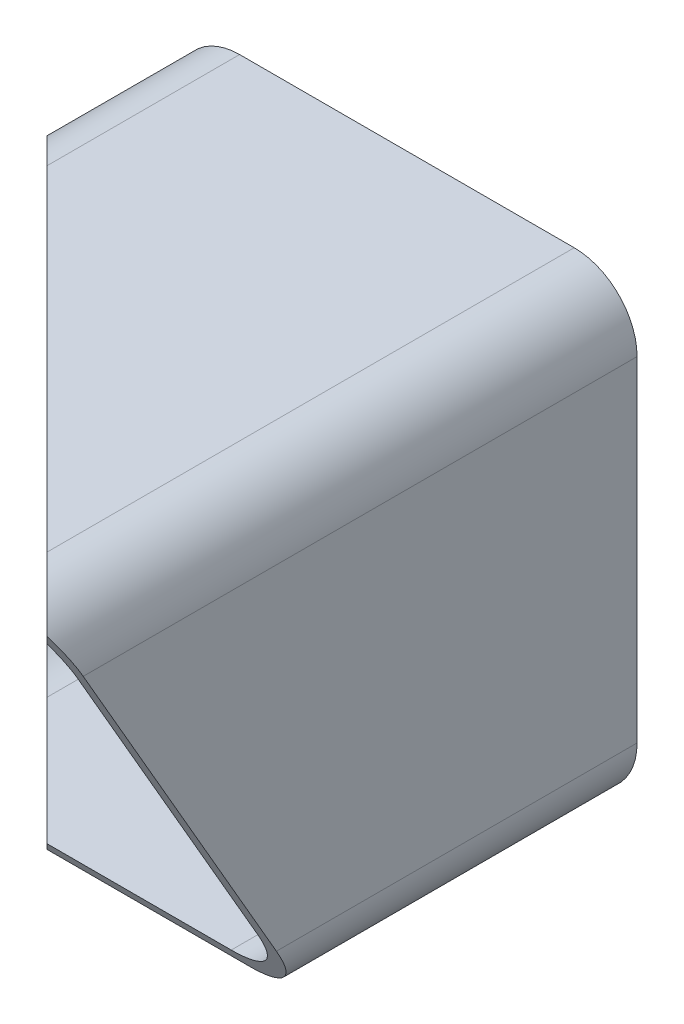
ISO-10303-21;
HEADER;
FILE_DESCRIPTION(('STEP AP214'),'2;1');
FILE_NAME('part.step','',(''),(''),'','','');
FILE_SCHEMA(('AUTOMOTIVE_DESIGN { 1 0 10303 214 1 1 1 1 }'));
ENDSEC;
DATA;
#1=APPLICATION_CONTEXT('core data for automotive mechanical design processes');
#2=APPLICATION_PROTOCOL_DEFINITION('international standard','automotive_design',2000,#1);
#3=PRODUCT_CONTEXT('',#1,'mechanical');
#4=PRODUCT('Part','Part','',(#3));
#5=PRODUCT_RELATED_PRODUCT_CATEGORY('part','',(#4));
#6=PRODUCT_DEFINITION_FORMATION('','',#4);
#7=PRODUCT_DEFINITION_CONTEXT('part definition',#1,'design');
#8=PRODUCT_DEFINITION('design','',#6,#7);
#9=PRODUCT_DEFINITION_SHAPE('','',#8);
#10=(LENGTH_UNIT() NAMED_UNIT(*) SI_UNIT(.MILLI.,.METRE.));
#11=(NAMED_UNIT(*) PLANE_ANGLE_UNIT() SI_UNIT($,.RADIAN.));
#12=(NAMED_UNIT(*) SI_UNIT($,.STERADIAN.) SOLID_ANGLE_UNIT());
#13=UNCERTAINTY_MEASURE_WITH_UNIT(LENGTH_MEASURE(1.E-05),#10,'distance_accuracy_value','');
#14=(GEOMETRIC_REPRESENTATION_CONTEXT(3) GLOBAL_UNCERTAINTY_ASSIGNED_CONTEXT((#13)) GLOBAL_UNIT_ASSIGNED_CONTEXT((#10,
#11,#12)) REPRESENTATION_CONTEXT('',''));
#15=CARTESIAN_POINT('',(0.,0.,0.));
#16=DIRECTION('',(0.,0.,1.));
#17=DIRECTION('',(1.,0.,0.));
#18=AXIS2_PLACEMENT_3D('',#15,#16,#17);
#19=CARTESIAN_POINT('',(0.,0.,-50.));
#20=DIRECTION('',(0.,0.,-1.));
#21=DIRECTION('',(-1.,0.,0.));
#22=AXIS2_PLACEMENT_3D('',#19,#20,#21);
#23=PLANE('',#22);
#24=DIRECTION('',(1.,0.,0.));
#25=VECTOR('',#24,1.);
#26=CARTESIAN_POINT('',(-39.,-39.,-50.));
#27=LINE('',#26,#25);
#28=CARTESIAN_POINT('',(-28.35,-39.,-50.));
#29=VERTEX_POINT('',#28);
#30=CARTESIAN_POINT('',(28.35,-39.,-50.));
#31=VERTEX_POINT('',#30);
#32=EDGE_CURVE('E255',#29,#31,#27,.T.);
#33=ORIENTED_EDGE('',*,*,#32,.F.);
#34=CARTESIAN_POINT('',(-28.35,-28.35,-50.));
#35=DIRECTION('',(0.,0.,-1.));
#36=DIRECTION('',(-1.,0.,0.));
#37=AXIS2_PLACEMENT_3D('',#34,#35,#36);
#38=CIRCLE('',#37,10.65);
#39=CARTESIAN_POINT('',(-39.,-28.35,-50.));
#40=VERTEX_POINT('',#39);
#41=EDGE_CURVE('E197',#29,#40,#38,.T.);
#42=ORIENTED_EDGE('',*,*,#41,.T.);
#43=DIRECTION('',(0.,-1.,0.));
#44=VECTOR('',#43,1.);
#45=CARTESIAN_POINT('',(-39.,-39.,-50.));
#46=LINE('',#45,#44);
#47=CARTESIAN_POINT('',(-39.,28.35,-50.));
#48=VERTEX_POINT('',#47);
#49=EDGE_CURVE('E253',#48,#40,#46,.T.);
#50=ORIENTED_EDGE('',*,*,#49,.F.);
#51=CARTESIAN_POINT('',(-28.35,28.35,-50.));
#52=DIRECTION('',(0.,0.,-1.));
#53=DIRECTION('',(-1.,0.,0.));
#54=AXIS2_PLACEMENT_3D('',#51,#52,#53);
#55=CIRCLE('',#54,10.65);
#56=CARTESIAN_POINT('',(-28.35,39.,-50.));
#57=VERTEX_POINT('',#56);
#58=EDGE_CURVE('E56',#48,#57,#55,.T.);
#59=ORIENTED_EDGE('',*,*,#58,.T.);
#60=DIRECTION('',(-1.,0.,0.));
#61=VECTOR('',#60,1.);
#62=CARTESIAN_POINT('',(-39.,39.,-50.));
#63=LINE('',#62,#61);
#64=CARTESIAN_POINT('',(28.35,39.,-50.));
#65=VERTEX_POINT('',#64);
#66=EDGE_CURVE('E251',#65,#57,#63,.T.);
#67=ORIENTED_EDGE('',*,*,#66,.F.);
#68=CARTESIAN_POINT('',(28.35,28.35,-50.));
#69=DIRECTION('',(0.,0.,-1.));
#70=DIRECTION('',(-1.,0.,0.));
#71=AXIS2_PLACEMENT_3D('',#68,#69,#70);
#72=CIRCLE('',#71,10.65);
#73=CARTESIAN_POINT('',(39.,28.35,-50.));
#74=VERTEX_POINT('',#73);
#75=EDGE_CURVE('E180',#65,#74,#72,.T.);
#76=ORIENTED_EDGE('',*,*,#75,.T.);
#77=DIRECTION('',(0.,1.,0.));
#78=VECTOR('',#77,1.);
#79=CARTESIAN_POINT('',(39.,-39.,-50.));
#80=LINE('',#79,#78);
#81=CARTESIAN_POINT('',(39.,-28.35,-50.));
#82=VERTEX_POINT('',#81);
#83=EDGE_CURVE('E248',#82,#74,#80,.T.);
#84=ORIENTED_EDGE('',*,*,#83,.F.);
#85=CARTESIAN_POINT('',(28.35,-28.35,-50.));
#86=DIRECTION('',(0.,0.,-1.));
#87=DIRECTION('',(-1.,0.,0.));
#88=AXIS2_PLACEMENT_3D('',#85,#86,#87);
#89=CIRCLE('',#88,10.65);
#90=EDGE_CURVE('E196',#82,#31,#89,.T.);
#91=ORIENTED_EDGE('',*,*,#90,.T.);
#92=EDGE_LOOP('',(#33,#42,#50,#59,#67,#76,#84,#91));
#93=FACE_BOUND('',#92,.T.);
#94=DIRECTION('',(0.,-1.,0.));
#95=VECTOR('',#94,1.);
#96=CARTESIAN_POINT('',(-37.,-37.,-50.));
#97=LINE('',#96,#95);
#98=CARTESIAN_POINT('',(-37.,26.35,-50.));
#99=VERTEX_POINT('',#98);
#100=CARTESIAN_POINT('',(-37.,-26.35,-50.));
#101=VERTEX_POINT('',#100);
#102=EDGE_CURVE('E242',#99,#101,#97,.T.);
#103=ORIENTED_EDGE('',*,*,#102,.T.);
#104=CARTESIAN_POINT('',(-26.35,-26.35,-50.));
#105=DIRECTION('',(0.,0.,-1.));
#106=DIRECTION('',(-1.,0.,0.));
#107=AXIS2_PLACEMENT_3D('',#104,#105,#106);
#108=CIRCLE('',#107,10.65);
#109=CARTESIAN_POINT('',(-26.35,-37.,-50.));
#110=VERTEX_POINT('',#109);
#111=EDGE_CURVE('E190',#101,#110,#108,.F.);
#112=ORIENTED_EDGE('',*,*,#111,.T.);
#113=DIRECTION('',(1.,0.,0.));
#114=VECTOR('',#113,1.);
#115=CARTESIAN_POINT('',(-37.,-37.,-50.));
#116=LINE('',#115,#114);
#117=CARTESIAN_POINT('',(26.35,-37.,-50.));
#118=VERTEX_POINT('',#117);
#119=EDGE_CURVE('E245',#110,#118,#116,.T.);
#120=ORIENTED_EDGE('',*,*,#119,.T.);
#121=CARTESIAN_POINT('',(26.35,-26.35,-50.));
#122=DIRECTION('',(0.,0.,-1.));
#123=DIRECTION('',(-1.,0.,0.));
#124=AXIS2_PLACEMENT_3D('',#121,#122,#123);
#125=CIRCLE('',#124,10.65);
#126=CARTESIAN_POINT('',(37.,-26.35,-50.));
#127=VERTEX_POINT('',#126);
#128=EDGE_CURVE('E181',#118,#127,#125,.F.);
#129=ORIENTED_EDGE('',*,*,#128,.T.);
#130=DIRECTION('',(0.,1.,0.));
#131=VECTOR('',#130,1.);
#132=CARTESIAN_POINT('',(37.,-37.,-50.));
#133=LINE('',#132,#131);
#134=CARTESIAN_POINT('',(37.,26.35,-50.));
#135=VERTEX_POINT('',#134);
#136=EDGE_CURVE('E236',#127,#135,#133,.T.);
#137=ORIENTED_EDGE('',*,*,#136,.T.);
#138=CARTESIAN_POINT('',(26.35,26.35,-50.));
#139=DIRECTION('',(0.,0.,-1.));
#140=DIRECTION('',(-1.,0.,0.));
#141=AXIS2_PLACEMENT_3D('',#138,#139,#140);
#142=CIRCLE('',#141,10.65);
#143=CARTESIAN_POINT('',(26.35,37.,-50.));
#144=VERTEX_POINT('',#143);
#145=EDGE_CURVE('E183',#135,#144,#142,.F.);
#146=ORIENTED_EDGE('',*,*,#145,.T.);
#147=DIRECTION('',(-1.,0.,0.));
#148=VECTOR('',#147,1.);
#149=CARTESIAN_POINT('',(-37.,37.,-50.));
#150=LINE('',#149,#148);
#151=CARTESIAN_POINT('',(-26.35,37.,-50.));
#152=VERTEX_POINT('',#151);
#153=EDGE_CURVE('E239',#144,#152,#150,.T.);
#154=ORIENTED_EDGE('',*,*,#153,.T.);
#155=CARTESIAN_POINT('',(-26.35,26.35,-50.));
#156=DIRECTION('',(0.,0.,-1.));
#157=DIRECTION('',(-1.,0.,0.));
#158=AXIS2_PLACEMENT_3D('',#155,#156,#157);
#159=CIRCLE('',#158,10.65);
#160=EDGE_CURVE('E192',#152,#99,#159,.F.);
#161=ORIENTED_EDGE('',*,*,#160,.T.);
#162=EDGE_LOOP('',(#103,#112,#120,#129,#137,#146,#154,#161));
#163=FACE_BOUND('',#162,.T.);
#164=ADVANCED_FACE('F33',(#93,#163),#23,.T.);
#165=CARTESIAN_POINT('',(39.,-39.,50.));
#166=DIRECTION('',(-1.,0.,0.));
#167=DIRECTION('',(0.,0.,1.));
#168=AXIS2_PLACEMENT_3D('',#165,#166,#167);
#169=PLANE('',#168);
#170=DIRECTION('',(0.,0.,-1.));
#171=VECTOR('',#170,1.);
#172=CARTESIAN_POINT('',(39.,28.35,50.));
#173=LINE('',#172,#171);
#174=CARTESIAN_POINT('',(39.,28.35,43.8512196331306));
#175=VERTEX_POINT('',#174);
#176=EDGE_CURVE('E285',#74,#175,#173,.F.);
#177=ORIENTED_EDGE('',*,*,#176,.T.);
#178=DIRECTION('',(0.,0.866025403784442,0.499999999999995));
#179=VECTOR('',#178,1.);
#180=CARTESIAN_POINT('',(39.,-39.,4.9666790032098));
#181=LINE('',#180,#179);
#182=CARTESIAN_POINT('',(39.,-28.35,11.1154593700792));
#183=VERTEX_POINT('',#182);
#184=EDGE_CURVE('E218',#183,#175,#181,.T.);
#185=ORIENTED_EDGE('',*,*,#184,.F.);
#186=DIRECTION('',(0.,0.,-1.));
#187=VECTOR('',#186,1.);
#188=CARTESIAN_POINT('',(39.,-28.35,50.));
#189=LINE('',#188,#187);
#190=EDGE_CURVE('E185',#183,#82,#189,.T.);
#191=ORIENTED_EDGE('',*,*,#190,.T.);
#192=ORIENTED_EDGE('',*,*,#83,.T.);
#193=EDGE_LOOP('',(#177,#185,#191,#192));
#194=FACE_BOUND('',#193,.T.);
#195=ADVANCED_FACE('F291',(#194),#169,.F.);
#196=CARTESIAN_POINT('',(-39.,39.,50.));
#197=DIRECTION('',(0.,-1.,0.));
#198=DIRECTION('',(0.,0.,-1.));
#199=AXIS2_PLACEMENT_3D('',#196,#197,#198);
#200=PLANE('',#199);
#201=DIRECTION('',(0.,0.,-1.));
#202=VECTOR('',#201,1.);
#203=CARTESIAN_POINT('',(-28.35,39.,50.));
#204=LINE('',#203,#202);
#205=CARTESIAN_POINT('',(-28.35,39.,-17.3499999999993));
#206=VERTEX_POINT('',#205);
#207=EDGE_CURVE('E176',#57,#206,#204,.F.);
#208=ORIENTED_EDGE('',*,*,#207,.T.);
#209=DIRECTION('',(-0.707106781186551,0.,-0.707106781186544));
#210=VECTOR('',#209,1.);
#211=CARTESIAN_POINT('',(39.,39.,50.));
#212=LINE('',#211,#210);
#213=CARTESIAN_POINT('',(28.35,39.,39.3500000000001));
#214=VERTEX_POINT('',#213);
#215=EDGE_CURVE('E161',#214,#206,#212,.T.);
#216=ORIENTED_EDGE('',*,*,#215,.F.);
#217=DIRECTION('',(0.,0.,-1.));
#218=VECTOR('',#217,1.);
#219=CARTESIAN_POINT('',(28.35,39.,50.));
#220=LINE('',#219,#218);
#221=EDGE_CURVE('E173',#214,#65,#220,.T.);
#222=ORIENTED_EDGE('',*,*,#221,.T.);
#223=ORIENTED_EDGE('',*,*,#66,.T.);
#224=EDGE_LOOP('',(#208,#216,#222,#223));
#225=FACE_BOUND('',#224,.T.);
#226=ADVANCED_FACE('F172',(#225),#200,.F.);
#227=CARTESIAN_POINT('',(-39.,-39.,50.));
#228=DIRECTION('',(1.,0.,0.));
#229=DIRECTION('',(0.,0.,-1.));
#230=AXIS2_PLACEMENT_3D('',#227,#228,#229);
#231=PLANE('',#230);
#232=DIRECTION('',(0.,0.,-1.));
#233=VECTOR('',#232,1.);
#234=CARTESIAN_POINT('',(-39.,-28.35,50.));
#235=LINE('',#234,#233);
#236=CARTESIAN_POINT('',(-39.,-28.35,-27.9999999999991));
#237=VERTEX_POINT('',#236);
#238=EDGE_CURVE('E277',#40,#237,#235,.F.);
#239=ORIENTED_EDGE('',*,*,#238,.T.);
#240=DIRECTION('',(0.,1.,0.));
#241=VECTOR('',#240,1.);
#242=CARTESIAN_POINT('',(-39.,-39.,-27.9999999999991));
#243=LINE('',#242,#241);
#244=CARTESIAN_POINT('',(-39.,28.35,-27.9999999999991));
#245=VERTEX_POINT('',#244);
#246=EDGE_CURVE('E315',#237,#245,#243,.T.);
#247=ORIENTED_EDGE('',*,*,#246,.T.);
#248=DIRECTION('',(0.,0.,-1.));
#249=VECTOR('',#248,1.);
#250=CARTESIAN_POINT('',(-39.,28.35,50.));
#251=LINE('',#250,#249);
#252=EDGE_CURVE('E275',#245,#48,#251,.T.);
#253=ORIENTED_EDGE('',*,*,#252,.T.);
#254=ORIENTED_EDGE('',*,*,#49,.T.);
#255=EDGE_LOOP('',(#239,#247,#253,#254));
#256=FACE_BOUND('',#255,.T.);
#257=ADVANCED_FACE('F318',(#256),#231,.F.);
#258=CARTESIAN_POINT('',(-39.,-39.,50.));
#259=DIRECTION('',(0.,1.,0.));
#260=DIRECTION('',(0.,0.,1.));
#261=AXIS2_PLACEMENT_3D('',#258,#259,#260);
#262=PLANE('',#261);
#263=DIRECTION('',(1.,0.,0.));
#264=VECTOR('',#263,1.);
#265=CARTESIAN_POINT('',(-39.,-39.,4.9666790032098));
#266=LINE('',#265,#264);
#267=CARTESIAN_POINT('',(-6.03332099679071,-39.,4.9666790032098));
#268=VERTEX_POINT('',#267);
#269=CARTESIAN_POINT('',(28.35,-39.,4.9666790032098));
#270=VERTEX_POINT('',#269);
#271=EDGE_CURVE('E205',#268,#270,#266,.T.);
#272=ORIENTED_EDGE('',*,*,#271,.F.);
#273=DIRECTION('',(-0.707106781186551,0.,-0.707106781186544));
#274=VECTOR('',#273,1.);
#275=CARTESIAN_POINT('',(39.,-39.,50.));
#276=LINE('',#275,#274);
#277=CARTESIAN_POINT('',(-28.35,-39.,-17.3499999999993));
#278=VERTEX_POINT('',#277);
#279=EDGE_CURVE('E48',#268,#278,#276,.T.);
#280=ORIENTED_EDGE('',*,*,#279,.T.);
#281=DIRECTION('',(0.,0.,-1.));
#282=VECTOR('',#281,1.);
#283=CARTESIAN_POINT('',(-28.35,-39.,50.));
#284=LINE('',#283,#282);
#285=EDGE_CURVE('E273',#278,#29,#284,.T.);
#286=ORIENTED_EDGE('',*,*,#285,.T.);
#287=ORIENTED_EDGE('',*,*,#32,.T.);
#288=DIRECTION('',(0.,0.,-1.));
#289=VECTOR('',#288,1.);
#290=CARTESIAN_POINT('',(28.35,-39.,50.));
#291=LINE('',#290,#289);
#292=EDGE_CURVE('E216',#31,#270,#291,.F.);
#293=ORIENTED_EDGE('',*,*,#292,.T.);
#294=EDGE_LOOP('',(#272,#280,#286,#287,#293));
#295=FACE_BOUND('',#294,.T.);
#296=ADVANCED_FACE('F212',(#295),#262,.F.);
#297=CARTESIAN_POINT('',(37.,-37.,50.));
#298=DIRECTION('',(-1.,0.,0.));
#299=DIRECTION('',(0.,0.,1.));
#300=AXIS2_PLACEMENT_3D('',#297,#298,#299);
#301=PLANE('',#300);
#302=DIRECTION('',(0.,-0.866025403784442,-0.499999999999995));
#303=VECTOR('',#302,1.);
#304=CARTESIAN_POINT('',(37.,-18.0000000000004,17.0910346561915));
#305=LINE('',#304,#303);
#306=CARTESIAN_POINT('',(37.,26.35,42.6965190947513));
#307=VERTEX_POINT('',#306);
#308=CARTESIAN_POINT('',(37.,-26.35,12.2701599084585));
#309=VERTEX_POINT('',#308);
#310=EDGE_CURVE('E227',#307,#309,#305,.T.);
#311=ORIENTED_EDGE('',*,*,#310,.F.);
#312=DIRECTION('',(0.,0.,-1.));
#313=VECTOR('',#312,1.);
#314=CARTESIAN_POINT('',(37.,26.35,-50.));
#315=LINE('',#314,#313);
#316=EDGE_CURVE('E262',#307,#135,#315,.T.);
#317=ORIENTED_EDGE('',*,*,#316,.T.);
#318=ORIENTED_EDGE('',*,*,#136,.F.);
#319=DIRECTION('',(0.,0.,-1.));
#320=VECTOR('',#319,1.);
#321=CARTESIAN_POINT('',(37.,-26.35,50.));
#322=LINE('',#321,#320);
#323=EDGE_CURVE('E264',#127,#309,#322,.F.);
#324=ORIENTED_EDGE('',*,*,#323,.T.);
#325=EDGE_LOOP('',(#311,#317,#318,#324));
#326=FACE_BOUND('',#325,.T.);
#327=ADVANCED_FACE('F345',(#326),#301,.T.);
#328=CARTESIAN_POINT('',(-37.,37.,50.));
#329=DIRECTION('',(0.,-1.,0.));
#330=DIRECTION('',(0.,0.,-1.));
#331=AXIS2_PLACEMENT_3D('',#328,#329,#330);
#332=PLANE('',#331);
#333=DIRECTION('',(0.707106781186551,0.,0.707106781186544));
#334=VECTOR('',#333,1.);
#335=CARTESIAN_POINT('',(0.999999999999578,37.,12.));
#336=LINE('',#335,#334);
#337=CARTESIAN_POINT('',(-26.35,37.,-15.3499999999993));
#338=VERTEX_POINT('',#337);
#339=CARTESIAN_POINT('',(26.35,37.,37.3500000000002));
#340=VERTEX_POINT('',#339);
#341=EDGE_CURVE('E303',#338,#340,#336,.T.);
#342=ORIENTED_EDGE('',*,*,#341,.F.);
#343=DIRECTION('',(0.,0.,-1.));
#344=VECTOR('',#343,1.);
#345=CARTESIAN_POINT('',(-26.35,37.,-50.));
#346=LINE('',#345,#344);
#347=EDGE_CURVE('E267',#338,#152,#346,.T.);
#348=ORIENTED_EDGE('',*,*,#347,.T.);
#349=ORIENTED_EDGE('',*,*,#153,.F.);
#350=DIRECTION('',(0.,0.,-1.));
#351=VECTOR('',#350,1.);
#352=CARTESIAN_POINT('',(26.35,37.,50.));
#353=LINE('',#352,#351);
#354=EDGE_CURVE('E269',#144,#340,#353,.F.);
#355=ORIENTED_EDGE('',*,*,#354,.T.);
#356=EDGE_LOOP('',(#342,#348,#349,#355));
#357=FACE_BOUND('',#356,.T.);
#358=ADVANCED_FACE('F382',(#357),#332,.T.);
#359=CARTESIAN_POINT('',(-37.,-37.,50.));
#360=DIRECTION('',(1.,0.,0.));
#361=DIRECTION('',(0.,0.,-1.));
#362=AXIS2_PLACEMENT_3D('',#359,#360,#361);
#363=PLANE('',#362);
#364=DIRECTION('',(0.,1.,0.));
#365=VECTOR('',#364,1.);
#366=CARTESIAN_POINT('',(-37.,-37.,-25.9999999999992));
#367=LINE('',#366,#365);
#368=CARTESIAN_POINT('',(-37.,-26.35,-25.9999999999991));
#369=VERTEX_POINT('',#368);
#370=CARTESIAN_POINT('',(-37.,26.35,-25.9999999999992));
#371=VERTEX_POINT('',#370);
#372=EDGE_CURVE('E308',#369,#371,#367,.T.);
#373=ORIENTED_EDGE('',*,*,#372,.F.);
#374=DIRECTION('',(0.,0.,-1.));
#375=VECTOR('',#374,1.);
#376=CARTESIAN_POINT('',(-37.,-26.35,-50.));
#377=LINE('',#376,#375);
#378=EDGE_CURVE('E283',#369,#101,#377,.T.);
#379=ORIENTED_EDGE('',*,*,#378,.T.);
#380=ORIENTED_EDGE('',*,*,#102,.F.);
#381=DIRECTION('',(0.,0.,-1.));
#382=VECTOR('',#381,1.);
#383=CARTESIAN_POINT('',(-37.,26.35,50.));
#384=LINE('',#383,#382);
#385=EDGE_CURVE('E280',#99,#371,#384,.F.);
#386=ORIENTED_EDGE('',*,*,#385,.T.);
#387=EDGE_LOOP('',(#373,#379,#380,#386));
#388=FACE_BOUND('',#387,.T.);
#389=ADVANCED_FACE('F361',(#388),#363,.T.);
#390=CARTESIAN_POINT('',(-37.,-37.,50.));
#391=DIRECTION('',(0.,1.,0.));
#392=DIRECTION('',(0.,0.,1.));
#393=AXIS2_PLACEMENT_3D('',#390,#391,#392);
#394=PLANE('',#393);
#395=DIRECTION('',(-0.707106781186551,0.,-0.707106781186544));
#396=VECTOR('',#395,1.);
#397=CARTESIAN_POINT('',(0.999999999999578,-37.,12.));
#398=LINE('',#397,#396);
#399=CARTESIAN_POINT('',(-4.87862045841147,-37.,6.12137954158903));
#400=VERTEX_POINT('',#399);
#401=CARTESIAN_POINT('',(-26.35,-37.,-15.3499999999993));
#402=VERTEX_POINT('',#401);
#403=EDGE_CURVE('E313',#400,#402,#398,.T.);
#404=ORIENTED_EDGE('',*,*,#403,.F.);
#405=DIRECTION('',(-1.,0.,0.));
#406=VECTOR('',#405,1.);
#407=CARTESIAN_POINT('',(-37.,-37.,6.12137954158903));
#408=LINE('',#407,#406);
#409=CARTESIAN_POINT('',(26.35,-37.,6.12137954158903));
#410=VERTEX_POINT('',#409);
#411=EDGE_CURVE('E208',#410,#400,#408,.T.);
#412=ORIENTED_EDGE('',*,*,#411,.F.);
#413=DIRECTION('',(0.,0.,-1.));
#414=VECTOR('',#413,1.);
#415=CARTESIAN_POINT('',(26.35,-37.,-50.));
#416=LINE('',#415,#414);
#417=EDGE_CURVE('E260',#410,#118,#416,.T.);
#418=ORIENTED_EDGE('',*,*,#417,.T.);
#419=ORIENTED_EDGE('',*,*,#119,.F.);
#420=DIRECTION('',(0.,0.,-1.));
#421=VECTOR('',#420,1.);
#422=CARTESIAN_POINT('',(-26.35,-37.,50.));
#423=LINE('',#422,#421);
#424=EDGE_CURVE('E257',#110,#402,#423,.F.);
#425=ORIENTED_EDGE('',*,*,#424,.T.);
#426=EDGE_LOOP('',(#404,#412,#418,#419,#425));
#427=FACE_BOUND('',#426,.T.);
#428=ADVANCED_FACE('F354',(#427),#394,.T.);
#429=CARTESIAN_POINT('',(26.35,-26.35,50.));
#430=DIRECTION('',(0.,0.,1.));
#431=DIRECTION('',(1.,0.,0.));
#432=AXIS2_PLACEMENT_3D('',#429,#430,#431);
#433=CYLINDRICAL_SURFACE('',#432,10.65);
#434=ORIENTED_EDGE('',*,*,#417,.F.);
#435=CARTESIAN_POINT('',(26.35,-26.35,12.2701599084585));
#436=DIRECTION('',(0.,0.499999999999995,-0.866025403784442));
#437=DIRECTION('',(0.,0.866025403784442,0.499999999999995));
#438=AXIS2_PLACEMENT_3D('',#435,#436,#437);
#439=ELLIPSE('',#438,12.297560733739,10.65);
#440=EDGE_CURVE('E229',#410,#309,#439,.F.);
#441=ORIENTED_EDGE('',*,*,#440,.T.);
#442=ORIENTED_EDGE('',*,*,#323,.F.);
#443=ORIENTED_EDGE('',*,*,#128,.F.);
#444=EDGE_LOOP('',(#434,#441,#442,#443));
#445=FACE_BOUND('',#444,.T.);
#446=ADVANCED_FACE('F333',(#445),#433,.F.);
#447=CARTESIAN_POINT('',(26.35,26.35,50.));
#448=DIRECTION('',(0.,0.,1.));
#449=DIRECTION('',(1.,0.,0.));
#450=AXIS2_PLACEMENT_3D('',#447,#448,#449);
#451=CYLINDRICAL_SURFACE('',#450,10.65);
#452=CARTESIAN_POINT('',(26.35,26.35,42.6965190947513));
#453=DIRECTION('',(0.,0.499999999999995,-0.866025403784442));
#454=DIRECTION('',(0.,0.866025403784442,0.499999999999995));
#455=AXIS2_PLACEMENT_3D('',#452,#453,#454);
#456=ELLIPSE('',#455,12.297560733739,10.65);
#457=CARTESIAN_POINT('',(35.1552920720609,32.3407705285466,46.1552920720609));
#458=VERTEX_POINT('',#457);
#459=EDGE_CURVE('E217',#307,#458,#456,.F.);
#460=ORIENTED_EDGE('',*,*,#459,.T.);
#461=CARTESIAN_POINT('',(26.35,26.35,37.3500000000002));
#462=DIRECTION('',(0.707106781186544,0.,-0.707106781186551));
#463=DIRECTION('',(0.707106781186551,0.,0.707106781186544));
#464=AXIS2_PLACEMENT_3D('',#461,#462,#463);
#465=ELLIPSE('',#464,15.0613744392734,10.65);
#466=EDGE_CURVE('E168',#458,#340,#465,.F.);
#467=ORIENTED_EDGE('',*,*,#466,.T.);
#468=ORIENTED_EDGE('',*,*,#354,.F.);
#469=ORIENTED_EDGE('',*,*,#145,.F.);
#470=ORIENTED_EDGE('',*,*,#316,.F.);
#471=EDGE_LOOP('',(#460,#467,#468,#469,#470));
#472=FACE_BOUND('',#471,.T.);
#473=ADVANCED_FACE('F325',(#472),#451,.F.);
#474=CARTESIAN_POINT('',(-28.35,-28.35,50.));
#475=DIRECTION('',(0.,0.,-1.));
#476=DIRECTION('',(-1.,0.,0.));
#477=AXIS2_PLACEMENT_3D('',#474,#475,#476);
#478=CYLINDRICAL_SURFACE('',#477,10.65);
#479=CARTESIAN_POINT('',(-28.35,-28.35,-17.3499999999992));
#480=DIRECTION('',(0.707106781186544,0.,-0.707106781186551));
#481=DIRECTION('',(-0.707106781186551,0.,-0.707106781186544));
#482=AXIS2_PLACEMENT_3D('',#479,#480,#481);
#483=ELLIPSE('',#482,15.0613744392734,10.65);
#484=EDGE_CURVE('E222',#237,#278,#483,.F.);
#485=ORIENTED_EDGE('',*,*,#484,.F.);
#486=ORIENTED_EDGE('',*,*,#238,.F.);
#487=ORIENTED_EDGE('',*,*,#41,.F.);
#488=ORIENTED_EDGE('',*,*,#285,.F.);
#489=EDGE_LOOP('',(#485,#486,#487,#488));
#490=FACE_BOUND('',#489,.T.);
#491=ADVANCED_FACE('F322',(#490),#478,.T.);
#492=CARTESIAN_POINT('',(-26.35,-26.35,50.));
#493=DIRECTION('',(0.,0.,1.));
#494=DIRECTION('',(1.,0.,0.));
#495=AXIS2_PLACEMENT_3D('',#492,#493,#494);
#496=CYLINDRICAL_SURFACE('',#495,10.65);
#497=ORIENTED_EDGE('',*,*,#378,.F.);
#498=CARTESIAN_POINT('',(-26.35,-26.35,-15.3499999999993));
#499=DIRECTION('',(0.707106781186544,0.,-0.707106781186551));
#500=DIRECTION('',(0.707106781186551,0.,0.707106781186544));
#501=AXIS2_PLACEMENT_3D('',#498,#499,#500);
#502=ELLIPSE('',#501,15.0613744392734,10.65);
#503=EDGE_CURVE('E310',#369,#402,#502,.F.);
#504=ORIENTED_EDGE('',*,*,#503,.T.);
#505=ORIENTED_EDGE('',*,*,#424,.F.);
#506=ORIENTED_EDGE('',*,*,#111,.F.);
#507=EDGE_LOOP('',(#497,#504,#505,#506));
#508=FACE_BOUND('',#507,.T.);
#509=ADVANCED_FACE('F324',(#508),#496,.F.);
#510=CARTESIAN_POINT('',(28.35,-28.35,50.));
#511=DIRECTION('',(0.,0.,-1.));
#512=DIRECTION('',(-1.,0.,0.));
#513=AXIS2_PLACEMENT_3D('',#510,#511,#512);
#514=CYLINDRICAL_SURFACE('',#513,10.65);
#515=CARTESIAN_POINT('',(28.35,-28.35,11.1154593700792));
#516=DIRECTION('',(0.,0.499999999999995,-0.866025403784442));
#517=DIRECTION('',(0.,-0.866025403784442,-0.499999999999995));
#518=AXIS2_PLACEMENT_3D('',#515,#516,#517);
#519=ELLIPSE('',#518,12.297560733739,10.65);
#520=EDGE_CURVE('E234',#270,#183,#519,.F.);
#521=ORIENTED_EDGE('',*,*,#520,.F.);
#522=ORIENTED_EDGE('',*,*,#292,.F.);
#523=ORIENTED_EDGE('',*,*,#90,.F.);
#524=ORIENTED_EDGE('',*,*,#190,.F.);
#525=EDGE_LOOP('',(#521,#522,#523,#524));
#526=FACE_BOUND('',#525,.T.);
#527=ADVANCED_FACE('F294',(#526),#514,.T.);
#528=CARTESIAN_POINT('',(28.35,28.35,50.));
#529=DIRECTION('',(0.,0.,-1.));
#530=DIRECTION('',(-1.,0.,0.));
#531=AXIS2_PLACEMENT_3D('',#528,#529,#530);
#532=CYLINDRICAL_SURFACE('',#531,10.65);
#533=CARTESIAN_POINT('',(28.35,28.35,39.3500000000001));
#534=DIRECTION('',(0.707106781186544,0.,-0.707106781186551));
#535=DIRECTION('',(-0.707106781186551,0.,-0.707106781186544));
#536=AXIS2_PLACEMENT_3D('',#533,#534,#535);
#537=ELLIPSE('',#536,15.0613744392734,10.65);
#538=CARTESIAN_POINT('',(36.6813855995666,34.9840420552884,47.6813855995666));
#539=VERTEX_POINT('',#538);
#540=EDGE_CURVE('E158',#539,#214,#537,.F.);
#541=ORIENTED_EDGE('',*,*,#540,.F.);
#542=CARTESIAN_POINT('',(28.35,28.35,43.8512196331306));
#543=DIRECTION('',(0.,0.499999999999995,-0.866025403784442));
#544=DIRECTION('',(0.,-0.866025403784442,-0.499999999999995));
#545=AXIS2_PLACEMENT_3D('',#542,#543,#544);
#546=ELLIPSE('',#545,12.297560733739,10.65);
#547=EDGE_CURVE('E232',#175,#539,#546,.F.);
#548=ORIENTED_EDGE('',*,*,#547,.F.);
#549=ORIENTED_EDGE('',*,*,#176,.F.);
#550=ORIENTED_EDGE('',*,*,#75,.F.);
#551=ORIENTED_EDGE('',*,*,#221,.F.);
#552=EDGE_LOOP('',(#541,#548,#549,#550,#551));
#553=FACE_BOUND('',#552,.T.);
#554=ADVANCED_FACE('F178',(#553),#532,.T.);
#555=CARTESIAN_POINT('',(-26.35,26.35,50.));
#556=DIRECTION('',(0.,0.,1.));
#557=DIRECTION('',(1.,0.,0.));
#558=AXIS2_PLACEMENT_3D('',#555,#556,#557);
#559=CYLINDRICAL_SURFACE('',#558,10.65);
#560=ORIENTED_EDGE('',*,*,#347,.F.);
#561=CARTESIAN_POINT('',(-26.35,26.35,-15.3499999999993));
#562=DIRECTION('',(0.707106781186544,0.,-0.707106781186551));
#563=DIRECTION('',(0.707106781186551,0.,0.707106781186544));
#564=AXIS2_PLACEMENT_3D('',#561,#562,#563);
#565=ELLIPSE('',#564,15.0613744392734,10.65);
#566=EDGE_CURVE('E305',#338,#371,#565,.F.);
#567=ORIENTED_EDGE('',*,*,#566,.T.);
#568=ORIENTED_EDGE('',*,*,#385,.F.);
#569=ORIENTED_EDGE('',*,*,#160,.F.);
#570=EDGE_LOOP('',(#560,#567,#568,#569));
#571=FACE_BOUND('',#570,.T.);
#572=ADVANCED_FACE('F378',(#571),#559,.F.);
#573=CARTESIAN_POINT('',(-28.35,28.35,50.));
#574=DIRECTION('',(0.,0.,-1.));
#575=DIRECTION('',(-1.,0.,0.));
#576=AXIS2_PLACEMENT_3D('',#573,#574,#575);
#577=CYLINDRICAL_SURFACE('',#576,10.65);
#578=CARTESIAN_POINT('',(-28.35,28.35,-17.3499999999992));
#579=DIRECTION('',(0.707106781186544,0.,-0.707106781186551));
#580=DIRECTION('',(-0.707106781186551,0.,-0.707106781186544));
#581=AXIS2_PLACEMENT_3D('',#578,#579,#580);
#582=ELLIPSE('',#581,15.0613744392734,10.65);
#583=EDGE_CURVE('E167',#206,#245,#582,.F.);
#584=ORIENTED_EDGE('',*,*,#583,.F.);
#585=ORIENTED_EDGE('',*,*,#207,.F.);
#586=ORIENTED_EDGE('',*,*,#58,.F.);
#587=ORIENTED_EDGE('',*,*,#252,.F.);
#588=EDGE_LOOP('',(#584,#585,#586,#587));
#589=FACE_BOUND('',#588,.T.);
#590=ADVANCED_FACE('F35',(#589),#577,.T.);
#591=CARTESIAN_POINT('',(-39.,-39.,4.9666790032098));
#592=DIRECTION('',(0.,0.499999999999995,-0.866025403784442));
#593=DIRECTION('',(0.,0.866025403784442,0.499999999999995));
#594=AXIS2_PLACEMENT_3D('',#591,#592,#593);
#595=PLANE('',#594);
#596=ORIENTED_EDGE('',*,*,#547,.T.);
#597=DIRECTION('',(-0.447213595499958,-0.774596669241486,-0.447213595499953));
#598=VECTOR('',#597,1.);
#599=CARTESIAN_POINT('',(-12.6266567974326,-50.4199925980745,-1.62665679743199));
#600=LINE('',#599,#598);
#601=EDGE_CURVE('E11',#539,#458,#600,.T.);
#602=ORIENTED_EDGE('',*,*,#601,.T.);
#603=ORIENTED_EDGE('',*,*,#459,.F.);
#604=ORIENTED_EDGE('',*,*,#310,.T.);
#605=ORIENTED_EDGE('',*,*,#440,.F.);
#606=ORIENTED_EDGE('',*,*,#411,.T.);
#607=EDGE_CURVE('E37',#400,#268,#600,.T.);
#608=ORIENTED_EDGE('',*,*,#607,.T.);
#609=ORIENTED_EDGE('',*,*,#271,.T.);
#610=ORIENTED_EDGE('',*,*,#520,.T.);
#611=ORIENTED_EDGE('',*,*,#184,.T.);
#612=EDGE_LOOP('',(#596,#602,#603,#604,#605,#606,#608,#609,#610,#611));
#613=FACE_BOUND('',#612,.T.);
#614=ADVANCED_FACE('F204',(#613),#595,.F.);
#615=CARTESIAN_POINT('',(39.,-39.,50.));
#616=DIRECTION('',(0.707106781186544,0.,-0.707106781186551));
#617=DIRECTION('',(-0.707106781186551,0.,-0.707106781186544));
#618=AXIS2_PLACEMENT_3D('',#615,#616,#617);
#619=PLANE('',#618);
#620=ORIENTED_EDGE('',*,*,#484,.T.);
#621=ORIENTED_EDGE('',*,*,#279,.F.);
#622=ORIENTED_EDGE('',*,*,#607,.F.);
#623=ORIENTED_EDGE('',*,*,#403,.T.);
#624=ORIENTED_EDGE('',*,*,#503,.F.);
#625=ORIENTED_EDGE('',*,*,#372,.T.);
#626=ORIENTED_EDGE('',*,*,#566,.F.);
#627=ORIENTED_EDGE('',*,*,#341,.T.);
#628=ORIENTED_EDGE('',*,*,#466,.F.);
#629=ORIENTED_EDGE('',*,*,#601,.F.);
#630=ORIENTED_EDGE('',*,*,#540,.T.);
#631=ORIENTED_EDGE('',*,*,#215,.T.);
#632=ORIENTED_EDGE('',*,*,#583,.T.);
#633=ORIENTED_EDGE('',*,*,#246,.F.);
#634=EDGE_LOOP('',(#620,#621,#622,#623,#624,#625,#626,#627,#628,#629,#630,#631,#632,#633));
#635=FACE_BOUND('',#634,.T.);
#636=ADVANCED_FACE('F160',(#635),#619,.F.);
#637=CLOSED_SHELL('',(#164,#195,#226,#257,#296,#327,#358,#389,#428,#446,#473,#491,#509,#527,
#554,#572,#590,#614,#636));
#638=MANIFOLD_SOLID_BREP('B2',#637);
#639=ADVANCED_BREP_SHAPE_REPRESENTATION('',(#18,#638),#14);
#640=SHAPE_DEFINITION_REPRESENTATION(#9,#639);
ENDSEC;
END-ISO-10303-21;
